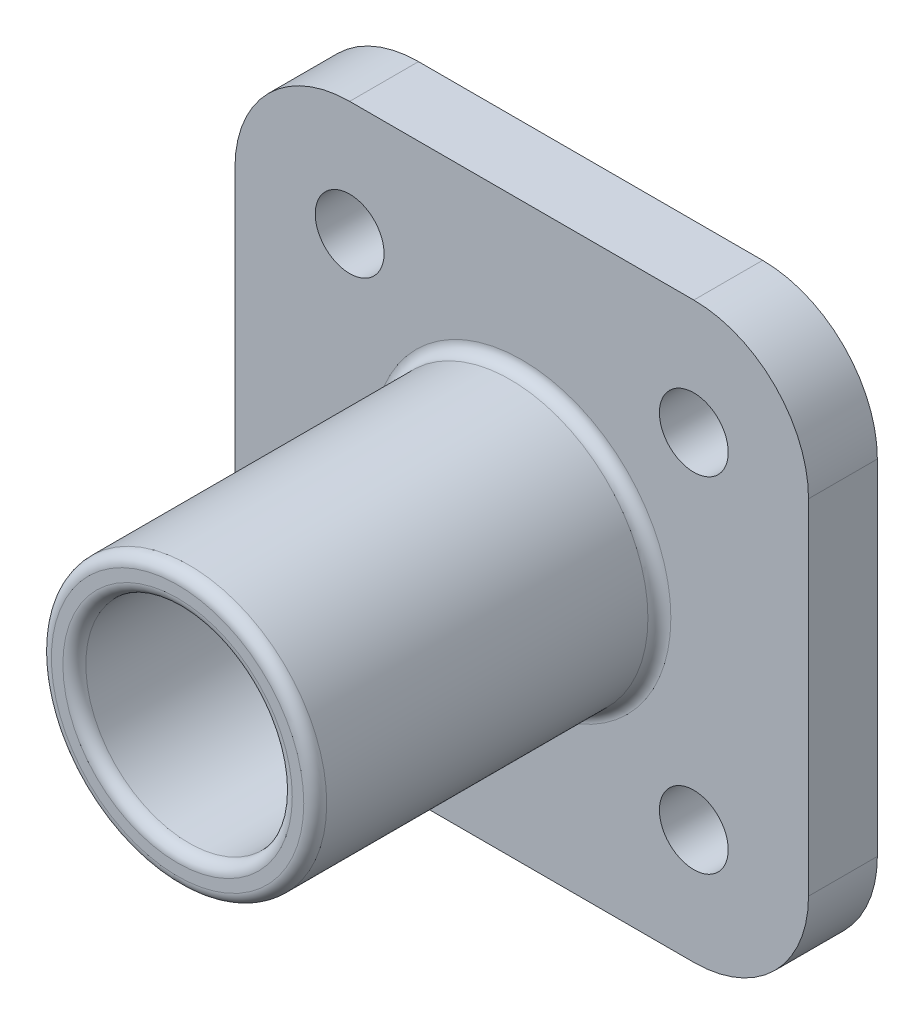
ISO-10303-21;
HEADER;
FILE_DESCRIPTION(('STEP AP214'),'2;1');
FILE_NAME('part.step','',(''),(''),'','','');
FILE_SCHEMA(('AUTOMOTIVE_DESIGN { 1 0 10303 214 1 1 1 1 }'));
ENDSEC;
DATA;
#1=APPLICATION_CONTEXT('core data for automotive mechanical design processes');
#2=APPLICATION_PROTOCOL_DEFINITION('international standard','automotive_design',2000,#1);
#3=PRODUCT_CONTEXT('',#1,'mechanical');
#4=PRODUCT('Part','Part','',(#3));
#5=PRODUCT_RELATED_PRODUCT_CATEGORY('part','',(#4));
#6=PRODUCT_DEFINITION_FORMATION('','',#4);
#7=PRODUCT_DEFINITION_CONTEXT('part definition',#1,'design');
#8=PRODUCT_DEFINITION('design','',#6,#7);
#9=PRODUCT_DEFINITION_SHAPE('','',#8);
#10=(LENGTH_UNIT() NAMED_UNIT(*) SI_UNIT(.MILLI.,.METRE.));
#11=(NAMED_UNIT(*) PLANE_ANGLE_UNIT() SI_UNIT($,.RADIAN.));
#12=(NAMED_UNIT(*) SI_UNIT($,.STERADIAN.) SOLID_ANGLE_UNIT());
#13=UNCERTAINTY_MEASURE_WITH_UNIT(LENGTH_MEASURE(1.E-05),#10,'distance_accuracy_value','');
#14=(GEOMETRIC_REPRESENTATION_CONTEXT(3) GLOBAL_UNCERTAINTY_ASSIGNED_CONTEXT((#13)) GLOBAL_UNIT_ASSIGNED_CONTEXT((#10,
#11,#12)) REPRESENTATION_CONTEXT('',''));
#15=CARTESIAN_POINT('',(0.,0.,0.));
#16=DIRECTION('',(0.,0.,1.));
#17=DIRECTION('',(1.,0.,0.));
#18=AXIS2_PLACEMENT_3D('',#15,#16,#17);
#19=CARTESIAN_POINT('',(7.5,-7.50000000000001,3.));
#20=DIRECTION('',(0.,0.,1.));
#21=DIRECTION('',(1.,0.,0.));
#22=AXIS2_PLACEMENT_3D('',#19,#20,#21);
#23=PLANE('',#22);
#24=CARTESIAN_POINT('',(0.,0.,3.));
#25=DIRECTION('',(0.,0.,1.));
#26=DIRECTION('',(1.,0.,0.));
#27=AXIS2_PLACEMENT_3D('',#24,#25,#26);
#28=CIRCLE('',#27,6.5);
#29=CARTESIAN_POINT('',(6.5,0.,3.));
#30=VERTEX_POINT('',#29);
#31=EDGE_CURVE('E12',#30,#30,#28,.F.);
#32=ORIENTED_EDGE('',*,*,#31,.T.);
#33=EDGE_LOOP('',(#32));
#34=FACE_BOUND('',#33,.T.);
#35=CARTESIAN_POINT('',(7.5,-7.5,3.));
#36=DIRECTION('',(0.,0.,1.));
#37=DIRECTION('',(1.,0.,0.));
#38=AXIS2_PLACEMENT_3D('',#35,#36,#37);
#39=CIRCLE('',#38,1.5);
#40=CARTESIAN_POINT('',(9.,-7.5,3.));
#41=VERTEX_POINT('',#40);
#42=EDGE_CURVE('E434',#41,#41,#39,.T.);
#43=ORIENTED_EDGE('',*,*,#42,.F.);
#44=EDGE_LOOP('',(#43));
#45=FACE_BOUND('',#44,.T.);
#46=CARTESIAN_POINT('',(-7.5,7.5,3.));
#47=DIRECTION('',(0.,0.,1.));
#48=DIRECTION('',(1.,0.,0.));
#49=AXIS2_PLACEMENT_3D('',#46,#47,#48);
#50=CIRCLE('',#49,1.5);
#51=CARTESIAN_POINT('',(-6.,7.5,3.));
#52=VERTEX_POINT('',#51);
#53=EDGE_CURVE('E141',#52,#52,#50,.T.);
#54=ORIENTED_EDGE('',*,*,#53,.F.);
#55=EDGE_LOOP('',(#54));
#56=FACE_BOUND('',#55,.T.);
#57=CARTESIAN_POINT('',(7.5,-7.50000000000001,3.));
#58=DIRECTION('',(0.,0.,1.));
#59=DIRECTION('',(1.,0.,0.));
#60=AXIS2_PLACEMENT_3D('',#57,#58,#59);
#61=CIRCLE('',#60,5.);
#62=CARTESIAN_POINT('',(7.49999999999997,-12.5,3.));
#63=VERTEX_POINT('',#62);
#64=CARTESIAN_POINT('',(12.5,-7.49999999999997,3.));
#65=VERTEX_POINT('',#64);
#66=EDGE_CURVE('E152',#63,#65,#61,.T.);
#67=ORIENTED_EDGE('',*,*,#66,.T.);
#68=DIRECTION('',(0.,1.,0.));
#69=VECTOR('',#68,1.);
#70=CARTESIAN_POINT('',(12.5,-7.49999999999997,3.));
#71=LINE('',#70,#69);
#72=CARTESIAN_POINT('',(12.5,7.49999999999996,3.));
#73=VERTEX_POINT('',#72);
#74=EDGE_CURVE('E100',#65,#73,#71,.T.);
#75=ORIENTED_EDGE('',*,*,#74,.T.);
#76=CARTESIAN_POINT('',(7.50000000000001,7.5,3.));
#77=DIRECTION('',(0.,0.,1.));
#78=DIRECTION('',(1.,0.,0.));
#79=AXIS2_PLACEMENT_3D('',#76,#77,#78);
#80=CIRCLE('',#79,5.);
#81=CARTESIAN_POINT('',(7.49999999999997,12.5,3.));
#82=VERTEX_POINT('',#81);
#83=EDGE_CURVE('E266',#73,#82,#80,.T.);
#84=ORIENTED_EDGE('',*,*,#83,.T.);
#85=DIRECTION('',(-1.,0.,0.));
#86=VECTOR('',#85,1.);
#87=CARTESIAN_POINT('',(7.49999999999997,12.5,3.));
#88=LINE('',#87,#86);
#89=CARTESIAN_POINT('',(-7.49999999999996,12.5,3.));
#90=VERTEX_POINT('',#89);
#91=EDGE_CURVE('E268',#82,#90,#88,.T.);
#92=ORIENTED_EDGE('',*,*,#91,.T.);
#93=CARTESIAN_POINT('',(-7.5,7.5,3.));
#94=DIRECTION('',(0.,0.,1.));
#95=DIRECTION('',(1.,0.,0.));
#96=AXIS2_PLACEMENT_3D('',#93,#94,#95);
#97=CIRCLE('',#96,5.);
#98=CARTESIAN_POINT('',(-12.5,7.49999999999996,3.));
#99=VERTEX_POINT('',#98);
#100=EDGE_CURVE('E119',#90,#99,#97,.T.);
#101=ORIENTED_EDGE('',*,*,#100,.T.);
#102=DIRECTION('',(0.,-1.,0.));
#103=VECTOR('',#102,1.);
#104=CARTESIAN_POINT('',(-12.5,-7.49999999999997,3.));
#105=LINE('',#104,#103);
#106=CARTESIAN_POINT('',(-12.5,-7.50000000000001,3.));
#107=VERTEX_POINT('',#106);
#108=EDGE_CURVE('E113',#99,#107,#105,.T.);
#109=ORIENTED_EDGE('',*,*,#108,.T.);
#110=CARTESIAN_POINT('',(-7.5,-7.50000000000001,3.));
#111=DIRECTION('',(0.,0.,1.));
#112=DIRECTION('',(-1.,0.,0.));
#113=AXIS2_PLACEMENT_3D('',#110,#111,#112);
#114=CIRCLE('',#113,5.);
#115=CARTESIAN_POINT('',(-7.49999999999996,-12.5,3.));
#116=VERTEX_POINT('',#115);
#117=EDGE_CURVE('E117',#107,#116,#114,.T.);
#118=ORIENTED_EDGE('',*,*,#117,.T.);
#119=DIRECTION('',(1.,0.,0.));
#120=VECTOR('',#119,1.);
#121=CARTESIAN_POINT('',(7.49999999999997,-12.5,3.));
#122=LINE('',#121,#120);
#123=EDGE_CURVE('E56',#116,#63,#122,.T.);
#124=ORIENTED_EDGE('',*,*,#123,.T.);
#125=EDGE_LOOP('',(#67,#75,#84,#92,#101,#109,#118,#124));
#126=FACE_BOUND('',#125,.T.);
#127=CARTESIAN_POINT('',(7.5,7.5,3.));
#128=DIRECTION('',(0.,0.,1.));
#129=DIRECTION('',(1.,0.,0.));
#130=AXIS2_PLACEMENT_3D('',#127,#128,#129);
#131=CIRCLE('',#130,1.5);
#132=CARTESIAN_POINT('',(9.,7.5,3.));
#133=VERTEX_POINT('',#132);
#134=EDGE_CURVE('E256',#133,#133,#131,.T.);
#135=ORIENTED_EDGE('',*,*,#134,.F.);
#136=EDGE_LOOP('',(#135));
#137=FACE_BOUND('',#136,.T.);
#138=CARTESIAN_POINT('',(-7.5,-7.5,3.));
#139=DIRECTION('',(0.,0.,1.));
#140=DIRECTION('',(1.,0.,0.));
#141=AXIS2_PLACEMENT_3D('',#138,#139,#140);
#142=CIRCLE('',#141,1.5);
#143=CARTESIAN_POINT('',(-6.,-7.5,3.));
#144=VERTEX_POINT('',#143);
#145=EDGE_CURVE('E429',#144,#144,#142,.T.);
#146=ORIENTED_EDGE('',*,*,#145,.F.);
#147=EDGE_LOOP('',(#146));
#148=FACE_BOUND('',#147,.T.);
#149=ADVANCED_FACE('F39',(#34,#45,#56,#126,#137,#148),#23,.T.);
#150=CARTESIAN_POINT('',(7.5,-7.50000000000001,0.));
#151=DIRECTION('',(0.,0.,1.));
#152=DIRECTION('',(1.,0.,0.));
#153=AXIS2_PLACEMENT_3D('',#150,#151,#152);
#154=PLANE('',#153);
#155=CARTESIAN_POINT('',(7.5,-7.50000000000001,0.));
#156=DIRECTION('',(0.,0.,1.));
#157=DIRECTION('',(1.,0.,0.));
#158=AXIS2_PLACEMENT_3D('',#155,#156,#157);
#159=CIRCLE('',#158,5.);
#160=CARTESIAN_POINT('',(7.49999999999997,-12.5,0.));
#161=VERTEX_POINT('',#160);
#162=CARTESIAN_POINT('',(12.5,-7.49999999999997,0.));
#163=VERTEX_POINT('',#162);
#164=EDGE_CURVE('E137',#161,#163,#159,.T.);
#165=ORIENTED_EDGE('',*,*,#164,.F.);
#166=DIRECTION('',(1.,0.,0.));
#167=VECTOR('',#166,1.);
#168=CARTESIAN_POINT('',(7.49999999999997,-12.5,0.));
#169=LINE('',#168,#167);
#170=CARTESIAN_POINT('',(-7.49999999999996,-12.5,0.));
#171=VERTEX_POINT('',#170);
#172=EDGE_CURVE('E91',#171,#161,#169,.T.);
#173=ORIENTED_EDGE('',*,*,#172,.F.);
#174=CARTESIAN_POINT('',(-7.5,-7.50000000000001,0.));
#175=DIRECTION('',(0.,0.,1.));
#176=DIRECTION('',(-1.,0.,0.));
#177=AXIS2_PLACEMENT_3D('',#174,#175,#176);
#178=CIRCLE('',#177,5.);
#179=CARTESIAN_POINT('',(-12.5,-7.50000000000001,0.));
#180=VERTEX_POINT('',#179);
#181=EDGE_CURVE('E85',#180,#171,#178,.T.);
#182=ORIENTED_EDGE('',*,*,#181,.F.);
#183=DIRECTION('',(0.,-1.,0.));
#184=VECTOR('',#183,1.);
#185=CARTESIAN_POINT('',(-12.5,-7.49999999999997,0.));
#186=LINE('',#185,#184);
#187=CARTESIAN_POINT('',(-12.5,7.49999999999996,0.));
#188=VERTEX_POINT('',#187);
#189=EDGE_CURVE('E127',#188,#180,#186,.T.);
#190=ORIENTED_EDGE('',*,*,#189,.F.);
#191=CARTESIAN_POINT('',(-7.5,7.5,0.));
#192=DIRECTION('',(0.,0.,1.));
#193=DIRECTION('',(1.,0.,0.));
#194=AXIS2_PLACEMENT_3D('',#191,#192,#193);
#195=CIRCLE('',#194,5.);
#196=CARTESIAN_POINT('',(-7.49999999999996,12.5,0.));
#197=VERTEX_POINT('',#196);
#198=EDGE_CURVE('E147',#197,#188,#195,.T.);
#199=ORIENTED_EDGE('',*,*,#198,.F.);
#200=DIRECTION('',(-1.,0.,0.));
#201=VECTOR('',#200,1.);
#202=CARTESIAN_POINT('',(7.49999999999997,12.5,0.));
#203=LINE('',#202,#201);
#204=CARTESIAN_POINT('',(7.49999999999997,12.5,0.));
#205=VERTEX_POINT('',#204);
#206=EDGE_CURVE('E145',#205,#197,#203,.T.);
#207=ORIENTED_EDGE('',*,*,#206,.F.);
#208=CARTESIAN_POINT('',(7.50000000000001,7.5,0.));
#209=DIRECTION('',(0.,0.,1.));
#210=DIRECTION('',(1.,0.,0.));
#211=AXIS2_PLACEMENT_3D('',#208,#209,#210);
#212=CIRCLE('',#211,5.);
#213=CARTESIAN_POINT('',(12.5,7.49999999999996,0.));
#214=VERTEX_POINT('',#213);
#215=EDGE_CURVE('E143',#214,#205,#212,.T.);
#216=ORIENTED_EDGE('',*,*,#215,.F.);
#217=DIRECTION('',(0.,1.,0.));
#218=VECTOR('',#217,1.);
#219=CARTESIAN_POINT('',(12.5,-7.49999999999997,0.));
#220=LINE('',#219,#218);
#221=EDGE_CURVE('E140',#163,#214,#220,.T.);
#222=ORIENTED_EDGE('',*,*,#221,.F.);
#223=EDGE_LOOP('',(#165,#173,#182,#190,#199,#207,#216,#222));
#224=FACE_BOUND('',#223,.T.);
#225=CARTESIAN_POINT('',(-7.5,7.5,0.));
#226=DIRECTION('',(0.,0.,1.));
#227=DIRECTION('',(1.,0.,0.));
#228=AXIS2_PLACEMENT_3D('',#225,#226,#227);
#229=CIRCLE('',#228,1.5);
#230=CARTESIAN_POINT('',(-6.,7.5,0.));
#231=VERTEX_POINT('',#230);
#232=EDGE_CURVE('E254',#231,#231,#229,.T.);
#233=ORIENTED_EDGE('',*,*,#232,.T.);
#234=EDGE_LOOP('',(#233));
#235=FACE_BOUND('',#234,.T.);
#236=CARTESIAN_POINT('',(7.5,7.5,0.));
#237=DIRECTION('',(0.,0.,1.));
#238=DIRECTION('',(1.,0.,0.));
#239=AXIS2_PLACEMENT_3D('',#236,#237,#238);
#240=CIRCLE('',#239,1.5);
#241=CARTESIAN_POINT('',(9.,7.5,0.));
#242=VERTEX_POINT('',#241);
#243=EDGE_CURVE('E260',#242,#242,#240,.T.);
#244=ORIENTED_EDGE('',*,*,#243,.T.);
#245=EDGE_LOOP('',(#244));
#246=FACE_BOUND('',#245,.T.);
#247=CARTESIAN_POINT('',(7.5,-7.5,0.));
#248=DIRECTION('',(0.,0.,1.));
#249=DIRECTION('',(1.,0.,0.));
#250=AXIS2_PLACEMENT_3D('',#247,#248,#249);
#251=CIRCLE('',#250,1.5);
#252=CARTESIAN_POINT('',(9.,-7.5,0.));
#253=VERTEX_POINT('',#252);
#254=EDGE_CURVE('E424',#253,#253,#251,.T.);
#255=ORIENTED_EDGE('',*,*,#254,.T.);
#256=EDGE_LOOP('',(#255));
#257=FACE_BOUND('',#256,.T.);
#258=CARTESIAN_POINT('',(-7.5,-7.5,0.));
#259=DIRECTION('',(0.,0.,1.));
#260=DIRECTION('',(1.,0.,0.));
#261=AXIS2_PLACEMENT_3D('',#258,#259,#260);
#262=CIRCLE('',#261,1.5);
#263=CARTESIAN_POINT('',(-6.,-7.5,0.));
#264=VERTEX_POINT('',#263);
#265=EDGE_CURVE('E427',#264,#264,#262,.T.);
#266=ORIENTED_EDGE('',*,*,#265,.T.);
#267=EDGE_LOOP('',(#266));
#268=FACE_BOUND('',#267,.T.);
#269=ADVANCED_FACE('F201',(#224,#235,#246,#257,#268),#154,.F.);
#270=CARTESIAN_POINT('',(7.5,-7.50000000000001,3.));
#271=DIRECTION('',(0.,0.,-1.));
#272=DIRECTION('',(-1.,0.,0.));
#273=AXIS2_PLACEMENT_3D('',#270,#271,#272);
#274=CYLINDRICAL_SURFACE('',#273,5.);
#275=ORIENTED_EDGE('',*,*,#164,.T.);
#276=DIRECTION('',(0.,0.,-1.));
#277=VECTOR('',#276,1.);
#278=CARTESIAN_POINT('',(12.5,-7.49999999999997,3.));
#279=LINE('',#278,#277);
#280=EDGE_CURVE('E165',#65,#163,#279,.T.);
#281=ORIENTED_EDGE('',*,*,#280,.F.);
#282=ORIENTED_EDGE('',*,*,#66,.F.);
#283=DIRECTION('',(0.,0.,-1.));
#284=VECTOR('',#283,1.);
#285=CARTESIAN_POINT('',(7.49999999999997,-12.5,3.));
#286=LINE('',#285,#284);
#287=EDGE_CURVE('E133',#63,#161,#286,.T.);
#288=ORIENTED_EDGE('',*,*,#287,.T.);
#289=EDGE_LOOP('',(#275,#281,#282,#288));
#290=FACE_BOUND('',#289,.T.);
#291=ADVANCED_FACE('F207',(#290),#274,.T.);
#292=CARTESIAN_POINT('',(12.5,-7.49999999999997,3.));
#293=DIRECTION('',(-1.,0.,0.));
#294=DIRECTION('',(0.,0.,1.));
#295=AXIS2_PLACEMENT_3D('',#292,#293,#294);
#296=PLANE('',#295);
#297=ORIENTED_EDGE('',*,*,#221,.T.);
#298=DIRECTION('',(0.,0.,-1.));
#299=VECTOR('',#298,1.);
#300=CARTESIAN_POINT('',(12.5,7.49999999999996,3.));
#301=LINE('',#300,#299);
#302=EDGE_CURVE('E162',#73,#214,#301,.T.);
#303=ORIENTED_EDGE('',*,*,#302,.F.);
#304=ORIENTED_EDGE('',*,*,#74,.F.);
#305=ORIENTED_EDGE('',*,*,#280,.T.);
#306=EDGE_LOOP('',(#297,#303,#304,#305));
#307=FACE_BOUND('',#306,.T.);
#308=ADVANCED_FACE('F284',(#307),#296,.F.);
#309=CARTESIAN_POINT('',(7.50000000000001,7.5,3.));
#310=DIRECTION('',(0.,0.,-1.));
#311=DIRECTION('',(-1.,0.,0.));
#312=AXIS2_PLACEMENT_3D('',#309,#310,#311);
#313=CYLINDRICAL_SURFACE('',#312,5.);
#314=ORIENTED_EDGE('',*,*,#215,.T.);
#315=DIRECTION('',(0.,0.,-1.));
#316=VECTOR('',#315,1.);
#317=CARTESIAN_POINT('',(7.49999999999997,12.5,3.));
#318=LINE('',#317,#316);
#319=EDGE_CURVE('E159',#82,#205,#318,.T.);
#320=ORIENTED_EDGE('',*,*,#319,.F.);
#321=ORIENTED_EDGE('',*,*,#83,.F.);
#322=ORIENTED_EDGE('',*,*,#302,.T.);
#323=EDGE_LOOP('',(#314,#320,#321,#322));
#324=FACE_BOUND('',#323,.T.);
#325=ADVANCED_FACE('F286',(#324),#313,.T.);
#326=CARTESIAN_POINT('',(7.49999999999997,12.5,3.));
#327=DIRECTION('',(0.,-1.,0.));
#328=DIRECTION('',(1.,0.,0.));
#329=AXIS2_PLACEMENT_3D('',#326,#327,#328);
#330=PLANE('',#329);
#331=ORIENTED_EDGE('',*,*,#206,.T.);
#332=DIRECTION('',(0.,0.,-1.));
#333=VECTOR('',#332,1.);
#334=CARTESIAN_POINT('',(-7.49999999999996,12.5,3.));
#335=LINE('',#334,#333);
#336=EDGE_CURVE('E156',#90,#197,#335,.T.);
#337=ORIENTED_EDGE('',*,*,#336,.F.);
#338=ORIENTED_EDGE('',*,*,#91,.F.);
#339=ORIENTED_EDGE('',*,*,#319,.T.);
#340=EDGE_LOOP('',(#331,#337,#338,#339));
#341=FACE_BOUND('',#340,.T.);
#342=ADVANCED_FACE('F274',(#341),#330,.F.);
#343=CARTESIAN_POINT('',(-7.5,7.5,3.));
#344=DIRECTION('',(0.,0.,-1.));
#345=DIRECTION('',(-1.,0.,0.));
#346=AXIS2_PLACEMENT_3D('',#343,#344,#345);
#347=CYLINDRICAL_SURFACE('',#346,5.);
#348=ORIENTED_EDGE('',*,*,#198,.T.);
#349=DIRECTION('',(0.,0.,-1.));
#350=VECTOR('',#349,1.);
#351=CARTESIAN_POINT('',(-12.5,7.49999999999996,3.));
#352=LINE('',#351,#350);
#353=EDGE_CURVE('E128',#99,#188,#352,.T.);
#354=ORIENTED_EDGE('',*,*,#353,.F.);
#355=ORIENTED_EDGE('',*,*,#100,.F.);
#356=ORIENTED_EDGE('',*,*,#336,.T.);
#357=EDGE_LOOP('',(#348,#354,#355,#356));
#358=FACE_BOUND('',#357,.T.);
#359=ADVANCED_FACE('F278',(#358),#347,.T.);
#360=CARTESIAN_POINT('',(-12.5,-7.49999999999997,3.));
#361=DIRECTION('',(1.,0.,0.));
#362=DIRECTION('',(0.,0.,-1.));
#363=AXIS2_PLACEMENT_3D('',#360,#361,#362);
#364=PLANE('',#363);
#365=ORIENTED_EDGE('',*,*,#189,.T.);
#366=DIRECTION('',(0.,0.,-1.));
#367=VECTOR('',#366,1.);
#368=CARTESIAN_POINT('',(-12.5,-7.50000000000001,3.));
#369=LINE('',#368,#367);
#370=EDGE_CURVE('E124',#107,#180,#369,.T.);
#371=ORIENTED_EDGE('',*,*,#370,.F.);
#372=ORIENTED_EDGE('',*,*,#108,.F.);
#373=ORIENTED_EDGE('',*,*,#353,.T.);
#374=EDGE_LOOP('',(#365,#371,#372,#373));
#375=FACE_BOUND('',#374,.T.);
#376=ADVANCED_FACE('F125',(#375),#364,.F.);
#377=CARTESIAN_POINT('',(-7.5,-7.50000000000001,3.));
#378=DIRECTION('',(0.,0.,-1.));
#379=DIRECTION('',(-1.,0.,0.));
#380=AXIS2_PLACEMENT_3D('',#377,#378,#379);
#381=CYLINDRICAL_SURFACE('',#380,5.);
#382=ORIENTED_EDGE('',*,*,#181,.T.);
#383=DIRECTION('',(0.,0.,-1.));
#384=VECTOR('',#383,1.);
#385=CARTESIAN_POINT('',(-7.49999999999996,-12.5,3.));
#386=LINE('',#385,#384);
#387=EDGE_CURVE('E129',#116,#171,#386,.T.);
#388=ORIENTED_EDGE('',*,*,#387,.F.);
#389=ORIENTED_EDGE('',*,*,#117,.F.);
#390=ORIENTED_EDGE('',*,*,#370,.T.);
#391=EDGE_LOOP('',(#382,#388,#389,#390));
#392=FACE_BOUND('',#391,.T.);
#393=ADVANCED_FACE('F131',(#392),#381,.T.);
#394=CARTESIAN_POINT('',(7.49999999999997,-12.5,3.));
#395=DIRECTION('',(0.,1.,0.));
#396=DIRECTION('',(-1.,0.,0.));
#397=AXIS2_PLACEMENT_3D('',#394,#395,#396);
#398=PLANE('',#397);
#399=ORIENTED_EDGE('',*,*,#172,.T.);
#400=ORIENTED_EDGE('',*,*,#287,.F.);
#401=ORIENTED_EDGE('',*,*,#123,.F.);
#402=ORIENTED_EDGE('',*,*,#387,.T.);
#403=EDGE_LOOP('',(#399,#400,#401,#402));
#404=FACE_BOUND('',#403,.T.);
#405=ADVANCED_FACE('F243',(#404),#398,.F.);
#406=CARTESIAN_POINT('',(-7.5,7.5,3.));
#407=DIRECTION('',(0.,0.,-1.));
#408=DIRECTION('',(-1.,0.,0.));
#409=AXIS2_PLACEMENT_3D('',#406,#407,#408);
#410=CYLINDRICAL_SURFACE('',#409,1.5);
#411=ORIENTED_EDGE('',*,*,#53,.T.);
#412=EDGE_LOOP('',(#411));
#413=FACE_BOUND('',#412,.T.);
#414=ORIENTED_EDGE('',*,*,#232,.F.);
#415=EDGE_LOOP('',(#414));
#416=FACE_BOUND('',#415,.T.);
#417=ADVANCED_FACE('F240',(#413,#416),#410,.F.);
#418=CARTESIAN_POINT('',(7.5,7.5,3.));
#419=DIRECTION('',(0.,0.,-1.));
#420=DIRECTION('',(-1.,0.,0.));
#421=AXIS2_PLACEMENT_3D('',#418,#419,#420);
#422=CYLINDRICAL_SURFACE('',#421,1.5);
#423=ORIENTED_EDGE('',*,*,#134,.T.);
#424=EDGE_LOOP('',(#423));
#425=FACE_BOUND('',#424,.T.);
#426=ORIENTED_EDGE('',*,*,#243,.F.);
#427=EDGE_LOOP('',(#426));
#428=FACE_BOUND('',#427,.T.);
#429=ADVANCED_FACE('F237',(#425,#428),#422,.F.);
#430=CARTESIAN_POINT('',(7.5,-7.5,3.));
#431=DIRECTION('',(0.,0.,-1.));
#432=DIRECTION('',(-1.,0.,0.));
#433=AXIS2_PLACEMENT_3D('',#430,#431,#432);
#434=CYLINDRICAL_SURFACE('',#433,1.5);
#435=ORIENTED_EDGE('',*,*,#42,.T.);
#436=EDGE_LOOP('',(#435));
#437=FACE_BOUND('',#436,.T.);
#438=ORIENTED_EDGE('',*,*,#254,.F.);
#439=EDGE_LOOP('',(#438));
#440=FACE_BOUND('',#439,.T.);
#441=ADVANCED_FACE('F233',(#437,#440),#434,.F.);
#442=CARTESIAN_POINT('',(-7.5,-7.5,3.));
#443=DIRECTION('',(0.,0.,-1.));
#444=DIRECTION('',(-1.,0.,0.));
#445=AXIS2_PLACEMENT_3D('',#442,#443,#444);
#446=CYLINDRICAL_SURFACE('',#445,1.5);
#447=ORIENTED_EDGE('',*,*,#145,.T.);
#448=EDGE_LOOP('',(#447));
#449=FACE_BOUND('',#448,.T.);
#450=ORIENTED_EDGE('',*,*,#265,.F.);
#451=EDGE_LOOP('',(#450));
#452=FACE_BOUND('',#451,.T.);
#453=ADVANCED_FACE('F228',(#449,#452),#446,.F.);
#454=CARTESIAN_POINT('',(0.,0.,18.));
#455=DIRECTION('',(0.,0.,1.));
#456=DIRECTION('',(1.,0.,0.));
#457=AXIS2_PLACEMENT_3D('',#454,#455,#456);
#458=PLANE('',#457);
#459=CARTESIAN_POINT('',(0.,0.,18.));
#460=DIRECTION('',(0.,0.,1.));
#461=DIRECTION('',(1.,0.,0.));
#462=AXIS2_PLACEMENT_3D('',#459,#460,#461);
#463=CIRCLE('',#462,5.5);
#464=CARTESIAN_POINT('',(5.5,0.,18.));
#465=VERTEX_POINT('',#464);
#466=EDGE_CURVE('E173',#465,#465,#463,.T.);
#467=ORIENTED_EDGE('',*,*,#466,.T.);
#468=EDGE_LOOP('',(#467));
#469=FACE_BOUND('',#468,.T.);
#470=CARTESIAN_POINT('',(0.,0.,18.));
#471=DIRECTION('',(0.,0.,1.));
#472=DIRECTION('',(1.,0.,0.));
#473=AXIS2_PLACEMENT_3D('',#470,#471,#472);
#474=CIRCLE('',#473,5.);
#475=CARTESIAN_POINT('',(5.,0.,18.));
#476=VERTEX_POINT('',#475);
#477=EDGE_CURVE('E170',#476,#476,#474,.F.);
#478=ORIENTED_EDGE('',*,*,#477,.T.);
#479=EDGE_LOOP('',(#478));
#480=FACE_BOUND('',#479,.T.);
#481=ADVANCED_FACE('F223',(#469,#480),#458,.T.);
#482=CARTESIAN_POINT('',(0.,0.,18.));
#483=DIRECTION('',(0.,0.,-1.));
#484=DIRECTION('',(-1.,0.,0.));
#485=AXIS2_PLACEMENT_3D('',#482,#483,#484);
#486=CYLINDRICAL_SURFACE('',#485,6.);
#487=CARTESIAN_POINT('',(0.,0.,17.5));
#488=DIRECTION('',(0.,0.,1.));
#489=DIRECTION('',(1.,0.,0.));
#490=AXIS2_PLACEMENT_3D('',#487,#488,#489);
#491=CIRCLE('',#490,6.);
#492=CARTESIAN_POINT('',(6.,0.,17.5));
#493=VERTEX_POINT('',#492);
#494=EDGE_CURVE('E179',#493,#493,#491,.F.);
#495=ORIENTED_EDGE('',*,*,#494,.T.);
#496=EDGE_LOOP('',(#495));
#497=FACE_BOUND('',#496,.T.);
#498=CARTESIAN_POINT('',(0.,0.,3.5));
#499=DIRECTION('',(0.,0.,1.));
#500=DIRECTION('',(1.,0.,0.));
#501=AXIS2_PLACEMENT_3D('',#498,#499,#500);
#502=CIRCLE('',#501,6.);
#503=CARTESIAN_POINT('',(6.,0.,3.5));
#504=VERTEX_POINT('',#503);
#505=EDGE_CURVE('E176',#504,#504,#502,.T.);
#506=ORIENTED_EDGE('',*,*,#505,.T.);
#507=EDGE_LOOP('',(#506));
#508=FACE_BOUND('',#507,.T.);
#509=ADVANCED_FACE('F217',(#497,#508),#486,.T.);
#510=CARTESIAN_POINT('',(0.,0.,18.));
#511=DIRECTION('',(0.,0.,-1.));
#512=DIRECTION('',(-1.,0.,0.));
#513=AXIS2_PLACEMENT_3D('',#510,#511,#512);
#514=CYLINDRICAL_SURFACE('',#513,4.5);
#515=CARTESIAN_POINT('',(0.,0.,17.5));
#516=DIRECTION('',(0.,0.,1.));
#517=DIRECTION('',(1.,0.,0.));
#518=AXIS2_PLACEMENT_3D('',#515,#516,#517);
#519=CIRCLE('',#518,4.5);
#520=CARTESIAN_POINT('',(4.5,0.,17.5));
#521=VERTEX_POINT('',#520);
#522=EDGE_CURVE('E48',#521,#521,#519,.T.);
#523=ORIENTED_EDGE('',*,*,#522,.T.);
#524=EDGE_LOOP('',(#523));
#525=FACE_BOUND('',#524,.T.);
#526=CARTESIAN_POINT('',(0.,0.,3.));
#527=DIRECTION('',(0.,0.,1.));
#528=DIRECTION('',(1.,0.,0.));
#529=AXIS2_PLACEMENT_3D('',#526,#527,#528);
#530=CIRCLE('',#529,4.5);
#531=CARTESIAN_POINT('',(4.5,0.,3.));
#532=VERTEX_POINT('',#531);
#533=EDGE_CURVE('E167',#532,#532,#530,.F.);
#534=ORIENTED_EDGE('',*,*,#533,.T.);
#535=EDGE_LOOP('',(#534));
#536=FACE_BOUND('',#535,.T.);
#537=ADVANCED_FACE('F184',(#525,#536),#514,.F.);
#538=ORIENTED_EDGE('',*,*,#533,.F.);
#539=EDGE_LOOP('',(#538));
#540=FACE_BOUND('',#539,.T.);
#541=ADVANCED_FACE('F196',(#540),#23,.T.);
#542=CARTESIAN_POINT('',(0.,0.,17.5));
#543=DIRECTION('',(0.,0.,1.));
#544=DIRECTION('',(1.,0.,0.));
#545=AXIS2_PLACEMENT_3D('',#542,#543,#544);
#546=TOROIDAL_SURFACE('',#545,5.5,0.5);
#547=ORIENTED_EDGE('',*,*,#494,.F.);
#548=EDGE_LOOP('',(#547));
#549=FACE_BOUND('',#548,.T.);
#550=ORIENTED_EDGE('',*,*,#466,.F.);
#551=EDGE_LOOP('',(#550));
#552=FACE_BOUND('',#551,.T.);
#553=ADVANCED_FACE('F189',(#549,#552),#546,.T.);
#554=CARTESIAN_POINT('',(0.,0.,17.5));
#555=DIRECTION('',(0.,0.,1.));
#556=DIRECTION('',(1.,0.,0.));
#557=AXIS2_PLACEMENT_3D('',#554,#555,#556);
#558=TOROIDAL_SURFACE('',#557,5.,0.5);
#559=ORIENTED_EDGE('',*,*,#477,.F.);
#560=EDGE_LOOP('',(#559));
#561=FACE_BOUND('',#560,.T.);
#562=ORIENTED_EDGE('',*,*,#522,.F.);
#563=EDGE_LOOP('',(#562));
#564=FACE_BOUND('',#563,.T.);
#565=ADVANCED_FACE('F187',(#561,#564),#558,.T.);
#566=CARTESIAN_POINT('',(0.,0.,3.5));
#567=DIRECTION('',(0.,0.,1.));
#568=DIRECTION('',(1.,0.,0.));
#569=AXIS2_PLACEMENT_3D('',#566,#567,#568);
#570=TOROIDAL_SURFACE('',#569,6.5,0.5);
#571=ORIENTED_EDGE('',*,*,#31,.F.);
#572=EDGE_LOOP('',(#571));
#573=FACE_BOUND('',#572,.T.);
#574=ORIENTED_EDGE('',*,*,#505,.F.);
#575=EDGE_LOOP('',(#574));
#576=FACE_BOUND('',#575,.T.);
#577=ADVANCED_FACE('F41',(#573,#576),#570,.F.);
#578=CLOSED_SHELL('',(#149,#269,#291,#308,#325,#342,#359,#376,#393,#405,#417,#429,#441,#453,
#481,#509,#537,#541,#553,#565,#577));
#579=MANIFOLD_SOLID_BREP('B2',#578);
#580=ADVANCED_BREP_SHAPE_REPRESENTATION('',(#18,#579),#14);
#581=SHAPE_DEFINITION_REPRESENTATION(#9,#580);
ENDSEC;
END-ISO-10303-21;
